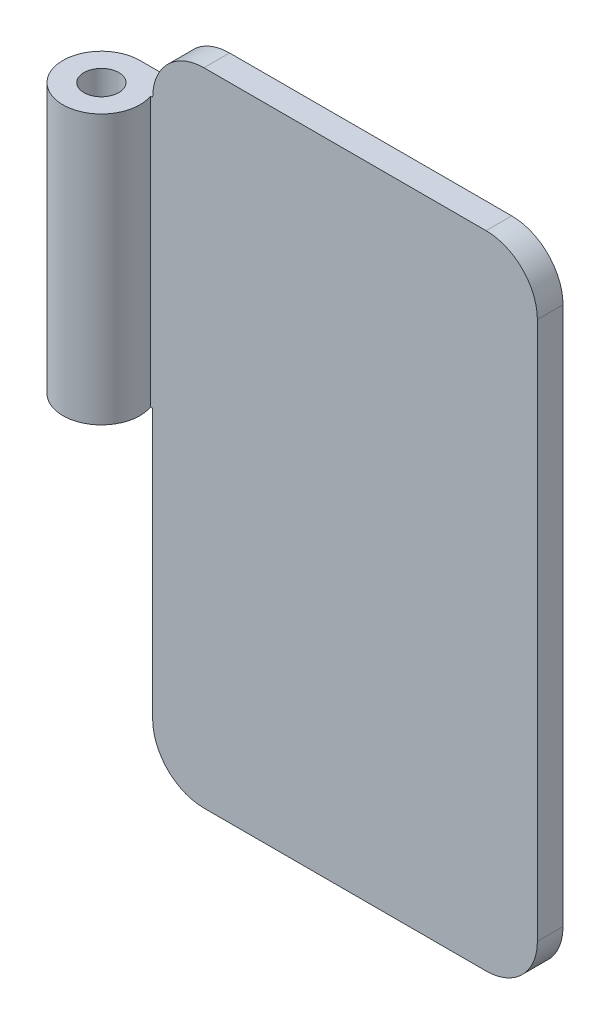
ISO-10303-21;
HEADER;
FILE_DESCRIPTION(('STEP AP214'),'2;1');
FILE_NAME('part.step','',(''),(''),'','','');
FILE_SCHEMA(('AUTOMOTIVE_DESIGN { 1 0 10303 214 1 1 1 1 }'));
ENDSEC;
DATA;
#1=APPLICATION_CONTEXT('core data for automotive mechanical design processes');
#2=APPLICATION_PROTOCOL_DEFINITION('international standard','automotive_design',2000,#1);
#3=PRODUCT_CONTEXT('',#1,'mechanical');
#4=PRODUCT('Part','Part','',(#3));
#5=PRODUCT_RELATED_PRODUCT_CATEGORY('part','',(#4));
#6=PRODUCT_DEFINITION_FORMATION('','',#4);
#7=PRODUCT_DEFINITION_CONTEXT('part definition',#1,'design');
#8=PRODUCT_DEFINITION('design','',#6,#7);
#9=PRODUCT_DEFINITION_SHAPE('','',#8);
#10=(LENGTH_UNIT() NAMED_UNIT(*) SI_UNIT(.MILLI.,.METRE.));
#11=(NAMED_UNIT(*) PLANE_ANGLE_UNIT() SI_UNIT($,.RADIAN.));
#12=(NAMED_UNIT(*) SI_UNIT($,.STERADIAN.) SOLID_ANGLE_UNIT());
#13=UNCERTAINTY_MEASURE_WITH_UNIT(LENGTH_MEASURE(1.E-05),#10,'distance_accuracy_value','');
#14=(GEOMETRIC_REPRESENTATION_CONTEXT(3) GLOBAL_UNCERTAINTY_ASSIGNED_CONTEXT((#13)) GLOBAL_UNIT_ASSIGNED_CONTEXT((#10,
#11,#12)) REPRESENTATION_CONTEXT('',''));
#15=CARTESIAN_POINT('',(0.,0.,0.));
#16=DIRECTION('',(0.,0.,1.));
#17=DIRECTION('',(1.,0.,0.));
#18=AXIS2_PLACEMENT_3D('',#15,#16,#17);
#19=CARTESIAN_POINT('',(6.75,14.125,1.));
#20=DIRECTION('',(0.,0.,-1.));
#21=DIRECTION('',(-1.,0.,0.));
#22=AXIS2_PLACEMENT_3D('',#19,#20,#21);
#23=CYLINDRICAL_SURFACE('',#22,2.);
#24=CARTESIAN_POINT('',(6.75,14.125,0.));
#25=DIRECTION('',(0.,0.,1.));
#26=DIRECTION('',(1.,0.,0.));
#27=AXIS2_PLACEMENT_3D('',#24,#25,#26);
#28=CIRCLE('',#27,2.);
#29=CARTESIAN_POINT('',(6.75000000000001,16.125,0.));
#30=VERTEX_POINT('',#29);
#31=CARTESIAN_POINT('',(4.75,14.125,0.));
#32=VERTEX_POINT('',#31);
#33=EDGE_CURVE('E156',#30,#32,#28,.T.);
#34=ORIENTED_EDGE('',*,*,#33,.T.);
#35=DIRECTION('',(0.,0.,-1.));
#36=VECTOR('',#35,1.);
#37=CARTESIAN_POINT('',(4.75,14.125,1.));
#38=LINE('',#37,#36);
#39=CARTESIAN_POINT('',(4.75,14.125,1.));
#40=VERTEX_POINT('',#39);
#41=EDGE_CURVE('E11',#40,#32,#38,.T.);
#42=ORIENTED_EDGE('',*,*,#41,.F.);
#43=CARTESIAN_POINT('',(6.75,14.125,1.));
#44=DIRECTION('',(0.,0.,1.));
#45=DIRECTION('',(1.,0.,0.));
#46=AXIS2_PLACEMENT_3D('',#43,#44,#45);
#47=CIRCLE('',#46,2.);
#48=CARTESIAN_POINT('',(6.75000000000001,16.125,1.));
#49=VERTEX_POINT('',#48);
#50=EDGE_CURVE('E107',#49,#40,#47,.T.);
#51=ORIENTED_EDGE('',*,*,#50,.F.);
#52=DIRECTION('',(0.,0.,-1.));
#53=VECTOR('',#52,1.);
#54=CARTESIAN_POINT('',(6.75000000000001,16.125,1.));
#55=LINE('',#54,#53);
#56=EDGE_CURVE('E152',#49,#30,#55,.T.);
#57=ORIENTED_EDGE('',*,*,#56,.T.);
#58=EDGE_LOOP('',(#34,#42,#51,#57));
#59=FACE_BOUND('',#58,.T.);
#60=ADVANCED_FACE('F44',(#59),#23,.T.);
#61=CARTESIAN_POINT('',(4.75,-6.875,1.));
#62=DIRECTION('',(1.,0.,0.));
#63=DIRECTION('',(0.,0.,-1.));
#64=AXIS2_PLACEMENT_3D('',#61,#62,#63);
#65=PLANE('',#64);
#66=DIRECTION('',(0.,-1.,0.));
#67=VECTOR('',#66,1.);
#68=CARTESIAN_POINT('',(4.75,-6.875,1.));
#69=LINE('',#68,#67);
#70=CARTESIAN_POINT('',(4.75,3.62499999999999,1.));
#71=VERTEX_POINT('',#70);
#72=CARTESIAN_POINT('',(4.75,-6.875,1.));
#73=VERTEX_POINT('',#72);
#74=EDGE_CURVE('E59',#71,#73,#69,.T.);
#75=ORIENTED_EDGE('',*,*,#74,.F.);
#76=DIRECTION('',(0.,0.,-1.));
#77=VECTOR('',#76,1.);
#78=CARTESIAN_POINT('',(4.75,3.62499999999999,0.));
#79=LINE('',#78,#77);
#80=CARTESIAN_POINT('',(4.75,3.62499999999999,0.));
#81=VERTEX_POINT('',#80);
#82=EDGE_CURVE('E236',#71,#81,#79,.T.);
#83=ORIENTED_EDGE('',*,*,#82,.T.);
#84=DIRECTION('',(0.,-1.,0.));
#85=VECTOR('',#84,1.);
#86=CARTESIAN_POINT('',(4.75,-6.875,0.));
#87=LINE('',#86,#85);
#88=CARTESIAN_POINT('',(4.75,-6.875,0.));
#89=VERTEX_POINT('',#88);
#90=EDGE_CURVE('E159',#81,#89,#87,.T.);
#91=ORIENTED_EDGE('',*,*,#90,.T.);
#92=DIRECTION('',(0.,0.,-1.));
#93=VECTOR('',#92,1.);
#94=CARTESIAN_POINT('',(4.75,-6.875,1.));
#95=LINE('',#94,#93);
#96=EDGE_CURVE('E52',#73,#89,#95,.T.);
#97=ORIENTED_EDGE('',*,*,#96,.F.);
#98=EDGE_LOOP('',(#75,#83,#91,#97));
#99=FACE_BOUND('',#98,.T.);
#100=ADVANCED_FACE('F289',(#99),#65,.F.);
#101=CARTESIAN_POINT('',(6.75,-6.87500000000001,1.));
#102=DIRECTION('',(0.,0.,-1.));
#103=DIRECTION('',(-1.,0.,0.));
#104=AXIS2_PLACEMENT_3D('',#101,#102,#103);
#105=CYLINDRICAL_SURFACE('',#104,2.);
#106=CARTESIAN_POINT('',(6.75,-6.87500000000001,0.));
#107=DIRECTION('',(0.,0.,1.));
#108=DIRECTION('',(1.,0.,0.));
#109=AXIS2_PLACEMENT_3D('',#106,#107,#108);
#110=CIRCLE('',#109,2.);
#111=CARTESIAN_POINT('',(6.75000000000001,-8.87500000000001,0.));
#112=VERTEX_POINT('',#111);
#113=EDGE_CURVE('E163',#89,#112,#110,.T.);
#114=ORIENTED_EDGE('',*,*,#113,.T.);
#115=DIRECTION('',(0.,0.,-1.));
#116=VECTOR('',#115,1.);
#117=CARTESIAN_POINT('',(6.75000000000001,-8.87500000000001,1.));
#118=LINE('',#117,#116);
#119=CARTESIAN_POINT('',(6.75000000000001,-8.87500000000001,1.));
#120=VERTEX_POINT('',#119);
#121=EDGE_CURVE('E189',#120,#112,#118,.T.);
#122=ORIENTED_EDGE('',*,*,#121,.F.);
#123=CARTESIAN_POINT('',(6.75,-6.87500000000001,1.));
#124=DIRECTION('',(0.,0.,1.));
#125=DIRECTION('',(1.,0.,0.));
#126=AXIS2_PLACEMENT_3D('',#123,#124,#125);
#127=CIRCLE('',#126,2.);
#128=EDGE_CURVE('E199',#73,#120,#127,.T.);
#129=ORIENTED_EDGE('',*,*,#128,.F.);
#130=ORIENTED_EDGE('',*,*,#96,.T.);
#131=EDGE_LOOP('',(#114,#122,#129,#130));
#132=FACE_BOUND('',#131,.T.);
#133=ADVANCED_FACE('F197',(#132),#105,.T.);
#134=CARTESIAN_POINT('',(17.75,-8.87500000000001,1.));
#135=DIRECTION('',(0.,1.,0.));
#136=DIRECTION('',(-1.,0.,0.));
#137=AXIS2_PLACEMENT_3D('',#134,#135,#136);
#138=PLANE('',#137);
#139=DIRECTION('',(1.,0.,0.));
#140=VECTOR('',#139,1.);
#141=CARTESIAN_POINT('',(17.75,-8.87500000000001,0.));
#142=LINE('',#141,#140);
#143=CARTESIAN_POINT('',(17.75,-8.87500000000001,0.));
#144=VERTEX_POINT('',#143);
#145=EDGE_CURVE('E166',#112,#144,#142,.T.);
#146=ORIENTED_EDGE('',*,*,#145,.T.);
#147=DIRECTION('',(0.,0.,-1.));
#148=VECTOR('',#147,1.);
#149=CARTESIAN_POINT('',(17.75,-8.87500000000001,1.));
#150=LINE('',#149,#148);
#151=CARTESIAN_POINT('',(17.75,-8.87500000000001,1.));
#152=VERTEX_POINT('',#151);
#153=EDGE_CURVE('E185',#152,#144,#150,.T.);
#154=ORIENTED_EDGE('',*,*,#153,.F.);
#155=DIRECTION('',(1.,0.,0.));
#156=VECTOR('',#155,1.);
#157=CARTESIAN_POINT('',(17.75,-8.87500000000001,1.));
#158=LINE('',#157,#156);
#159=EDGE_CURVE('E215',#120,#152,#158,.T.);
#160=ORIENTED_EDGE('',*,*,#159,.F.);
#161=ORIENTED_EDGE('',*,*,#121,.T.);
#162=EDGE_LOOP('',(#146,#154,#160,#161));
#163=FACE_BOUND('',#162,.T.);
#164=ADVANCED_FACE('F210',(#163),#138,.F.);
#165=CARTESIAN_POINT('',(17.75,-6.87500000000001,1.));
#166=DIRECTION('',(0.,0.,-1.));
#167=DIRECTION('',(-1.,0.,0.));
#168=AXIS2_PLACEMENT_3D('',#165,#166,#167);
#169=CYLINDRICAL_SURFACE('',#168,2.);
#170=CARTESIAN_POINT('',(17.75,-6.87500000000001,0.));
#171=DIRECTION('',(0.,0.,1.));
#172=DIRECTION('',(1.,0.,0.));
#173=AXIS2_PLACEMENT_3D('',#170,#171,#172);
#174=CIRCLE('',#173,2.);
#175=CARTESIAN_POINT('',(19.75,-6.875,0.));
#176=VERTEX_POINT('',#175);
#177=EDGE_CURVE('E169',#144,#176,#174,.T.);
#178=ORIENTED_EDGE('',*,*,#177,.T.);
#179=DIRECTION('',(0.,0.,-1.));
#180=VECTOR('',#179,1.);
#181=CARTESIAN_POINT('',(19.75,-6.875,1.));
#182=LINE('',#181,#180);
#183=CARTESIAN_POINT('',(19.75,-6.875,1.));
#184=VERTEX_POINT('',#183);
#185=EDGE_CURVE('E145',#184,#176,#182,.T.);
#186=ORIENTED_EDGE('',*,*,#185,.F.);
#187=CARTESIAN_POINT('',(17.75,-6.87500000000001,1.));
#188=DIRECTION('',(0.,0.,1.));
#189=DIRECTION('',(1.,0.,0.));
#190=AXIS2_PLACEMENT_3D('',#187,#188,#189);
#191=CIRCLE('',#190,2.);
#192=EDGE_CURVE('E131',#152,#184,#191,.T.);
#193=ORIENTED_EDGE('',*,*,#192,.F.);
#194=ORIENTED_EDGE('',*,*,#153,.T.);
#195=EDGE_LOOP('',(#178,#186,#193,#194));
#196=FACE_BOUND('',#195,.T.);
#197=ADVANCED_FACE('F213',(#196),#169,.T.);
#198=CARTESIAN_POINT('',(19.75,-6.875,1.));
#199=DIRECTION('',(-1.,0.,0.));
#200=DIRECTION('',(0.,0.,1.));
#201=AXIS2_PLACEMENT_3D('',#198,#199,#200);
#202=PLANE('',#201);
#203=DIRECTION('',(0.,1.,0.));
#204=VECTOR('',#203,1.);
#205=CARTESIAN_POINT('',(19.75,-6.875,0.));
#206=LINE('',#205,#204);
#207=CARTESIAN_POINT('',(19.75,14.125,0.));
#208=VERTEX_POINT('',#207);
#209=EDGE_CURVE('E141',#176,#208,#206,.T.);
#210=ORIENTED_EDGE('',*,*,#209,.T.);
#211=DIRECTION('',(0.,0.,-1.));
#212=VECTOR('',#211,1.);
#213=CARTESIAN_POINT('',(19.75,14.125,1.));
#214=LINE('',#213,#212);
#215=CARTESIAN_POINT('',(19.75,14.125,1.));
#216=VERTEX_POINT('',#215);
#217=EDGE_CURVE('E138',#216,#208,#214,.T.);
#218=ORIENTED_EDGE('',*,*,#217,.F.);
#219=DIRECTION('',(0.,1.,0.));
#220=VECTOR('',#219,1.);
#221=CARTESIAN_POINT('',(19.75,-6.875,1.));
#222=LINE('',#221,#220);
#223=EDGE_CURVE('E124',#184,#216,#222,.T.);
#224=ORIENTED_EDGE('',*,*,#223,.F.);
#225=ORIENTED_EDGE('',*,*,#185,.T.);
#226=EDGE_LOOP('',(#210,#218,#224,#225));
#227=FACE_BOUND('',#226,.T.);
#228=ADVANCED_FACE('F139',(#227),#202,.F.);
#229=CARTESIAN_POINT('',(17.75,14.125,1.));
#230=DIRECTION('',(0.,0.,-1.));
#231=DIRECTION('',(-1.,0.,0.));
#232=AXIS2_PLACEMENT_3D('',#229,#230,#231);
#233=CYLINDRICAL_SURFACE('',#232,2.);
#234=CARTESIAN_POINT('',(17.75,14.125,0.));
#235=DIRECTION('',(0.,0.,1.));
#236=DIRECTION('',(1.,0.,0.));
#237=AXIS2_PLACEMENT_3D('',#234,#235,#236);
#238=CIRCLE('',#237,2.);
#239=CARTESIAN_POINT('',(17.75,16.125,0.));
#240=VERTEX_POINT('',#239);
#241=EDGE_CURVE('E174',#208,#240,#238,.T.);
#242=ORIENTED_EDGE('',*,*,#241,.T.);
#243=DIRECTION('',(0.,0.,-1.));
#244=VECTOR('',#243,1.);
#245=CARTESIAN_POINT('',(17.75,16.125,1.));
#246=LINE('',#245,#244);
#247=CARTESIAN_POINT('',(17.75,16.125,1.));
#248=VERTEX_POINT('',#247);
#249=EDGE_CURVE('E146',#248,#240,#246,.T.);
#250=ORIENTED_EDGE('',*,*,#249,.F.);
#251=CARTESIAN_POINT('',(17.75,14.125,1.));
#252=DIRECTION('',(0.,0.,1.));
#253=DIRECTION('',(1.,0.,0.));
#254=AXIS2_PLACEMENT_3D('',#251,#252,#253);
#255=CIRCLE('',#254,2.);
#256=EDGE_CURVE('E128',#216,#248,#255,.T.);
#257=ORIENTED_EDGE('',*,*,#256,.F.);
#258=ORIENTED_EDGE('',*,*,#217,.T.);
#259=EDGE_LOOP('',(#242,#250,#257,#258));
#260=FACE_BOUND('',#259,.T.);
#261=ADVANCED_FACE('F148',(#260),#233,.T.);
#262=CARTESIAN_POINT('',(17.75,16.125,1.));
#263=DIRECTION('',(0.,-1.,0.));
#264=DIRECTION('',(1.,0.,0.));
#265=AXIS2_PLACEMENT_3D('',#262,#263,#264);
#266=PLANE('',#265);
#267=DIRECTION('',(-1.,0.,0.));
#268=VECTOR('',#267,1.);
#269=CARTESIAN_POINT('',(17.75,16.125,0.));
#270=LINE('',#269,#268);
#271=EDGE_CURVE('E101',#240,#30,#270,.T.);
#272=ORIENTED_EDGE('',*,*,#271,.T.);
#273=ORIENTED_EDGE('',*,*,#56,.F.);
#274=DIRECTION('',(-1.,0.,0.));
#275=VECTOR('',#274,1.);
#276=CARTESIAN_POINT('',(17.75,16.125,1.));
#277=LINE('',#276,#275);
#278=EDGE_CURVE('E68',#248,#49,#277,.T.);
#279=ORIENTED_EDGE('',*,*,#278,.F.);
#280=ORIENTED_EDGE('',*,*,#249,.T.);
#281=EDGE_LOOP('',(#272,#273,#279,#280));
#282=FACE_BOUND('',#281,.T.);
#283=ADVANCED_FACE('F306',(#282),#266,.F.);
#284=CARTESIAN_POINT('',(6.75,14.125,1.));
#285=DIRECTION('',(0.,0.,1.));
#286=DIRECTION('',(1.,0.,0.));
#287=AXIS2_PLACEMENT_3D('',#284,#285,#286);
#288=PLANE('',#287);
#289=ORIENTED_EDGE('',*,*,#50,.T.);
#290=DIRECTION('',(-1.,0.,0.));
#291=VECTOR('',#290,1.);
#292=CARTESIAN_POINT('',(0.,14.125,1.));
#293=LINE('',#292,#291);
#294=CARTESIAN_POINT('',(4.66421356237309,14.125,1.));
#295=VERTEX_POINT('',#294);
#296=EDGE_CURVE('E160',#40,#295,#293,.T.);
#297=ORIENTED_EDGE('',*,*,#296,.T.);
#298=DIRECTION('',(0.,1.,0.));
#299=VECTOR('',#298,1.);
#300=CARTESIAN_POINT('',(4.66421356237309,1.82222436226799,1.));
#301=LINE('',#300,#299);
#302=CARTESIAN_POINT('',(4.66421356237309,3.62499999999999,1.));
#303=VERTEX_POINT('',#302);
#304=EDGE_CURVE('E229',#303,#295,#301,.T.);
#305=ORIENTED_EDGE('',*,*,#304,.F.);
#306=DIRECTION('',(-1.,0.,0.));
#307=VECTOR('',#306,1.);
#308=CARTESIAN_POINT('',(0.,3.62499999999999,1.));
#309=LINE('',#308,#307);
#310=EDGE_CURVE('E237',#71,#303,#309,.T.);
#311=ORIENTED_EDGE('',*,*,#310,.F.);
#312=ORIENTED_EDGE('',*,*,#74,.T.);
#313=ORIENTED_EDGE('',*,*,#128,.T.);
#314=ORIENTED_EDGE('',*,*,#159,.T.);
#315=ORIENTED_EDGE('',*,*,#192,.T.);
#316=ORIENTED_EDGE('',*,*,#223,.T.);
#317=ORIENTED_EDGE('',*,*,#256,.T.);
#318=ORIENTED_EDGE('',*,*,#278,.T.);
#319=EDGE_LOOP('',(#289,#297,#305,#311,#312,#313,#314,#315,#316,#317,#318));
#320=FACE_BOUND('',#319,.T.);
#321=ADVANCED_FACE('F126',(#320),#288,.T.);
#322=CARTESIAN_POINT('',(6.75,14.125,0.));
#323=DIRECTION('',(0.,0.,1.));
#324=DIRECTION('',(1.,0.,0.));
#325=AXIS2_PLACEMENT_3D('',#322,#323,#324);
#326=PLANE('',#325);
#327=ORIENTED_EDGE('',*,*,#33,.F.);
#328=ORIENTED_EDGE('',*,*,#271,.F.);
#329=ORIENTED_EDGE('',*,*,#241,.F.);
#330=ORIENTED_EDGE('',*,*,#209,.F.);
#331=ORIENTED_EDGE('',*,*,#177,.F.);
#332=ORIENTED_EDGE('',*,*,#145,.F.);
#333=ORIENTED_EDGE('',*,*,#113,.F.);
#334=ORIENTED_EDGE('',*,*,#90,.F.);
#335=DIRECTION('',(-1.,0.,0.));
#336=VECTOR('',#335,1.);
#337=CARTESIAN_POINT('',(0.,3.62499999999999,0.));
#338=LINE('',#337,#336);
#339=CARTESIAN_POINT('',(3.25,3.62499999999999,0.));
#340=VERTEX_POINT('',#339);
#341=EDGE_CURVE('E230',#81,#340,#338,.T.);
#342=ORIENTED_EDGE('',*,*,#341,.T.);
#343=DIRECTION('',(0.,1.,0.));
#344=VECTOR('',#343,1.);
#345=CARTESIAN_POINT('',(3.25,1.82222436226799,0.));
#346=LINE('',#345,#344);
#347=CARTESIAN_POINT('',(3.25,14.125,0.));
#348=VERTEX_POINT('',#347);
#349=EDGE_CURVE('E225',#340,#348,#346,.T.);
#350=ORIENTED_EDGE('',*,*,#349,.T.);
#351=DIRECTION('',(-1.,0.,0.));
#352=VECTOR('',#351,1.);
#353=CARTESIAN_POINT('',(0.,14.125,0.));
#354=LINE('',#353,#352);
#355=EDGE_CURVE('E241',#32,#348,#354,.T.);
#356=ORIENTED_EDGE('',*,*,#355,.F.);
#357=EDGE_LOOP('',(#327,#328,#329,#330,#331,#332,#333,#334,#342,#350,#356));
#358=FACE_BOUND('',#357,.T.);
#359=ADVANCED_FACE('F204',(#358),#326,.F.);
#360=CARTESIAN_POINT('',(0.,3.62499999999999,1.5));
#361=DIRECTION('',(0.,-1.,0.));
#362=DIRECTION('',(1.,0.,0.));
#363=AXIS2_PLACEMENT_3D('',#360,#361,#362);
#364=PLANE('',#363);
#365=ORIENTED_EDGE('',*,*,#82,.F.);
#366=ORIENTED_EDGE('',*,*,#310,.T.);
#367=CARTESIAN_POINT('',(3.25,3.62499999999999,1.5));
#368=DIRECTION('',(0.,1.,0.));
#369=DIRECTION('',(-1.,0.,0.));
#370=AXIS2_PLACEMENT_3D('',#367,#368,#369);
#371=CIRCLE('',#370,1.5);
#372=EDGE_CURVE('E242',#340,#303,#371,.T.);
#373=ORIENTED_EDGE('',*,*,#372,.F.);
#374=ORIENTED_EDGE('',*,*,#341,.F.);
#375=EDGE_LOOP('',(#365,#366,#373,#374));
#376=FACE_BOUND('',#375,.T.);
#377=CARTESIAN_POINT('',(3.25,3.62499999999999,1.5));
#378=DIRECTION('',(0.,1.,0.));
#379=DIRECTION('',(-1.,0.,0.));
#380=AXIS2_PLACEMENT_3D('',#377,#378,#379);
#381=CIRCLE('',#380,0.680000000000002);
#382=CARTESIAN_POINT('',(2.56999999999999,3.62499999999999,1.5));
#383=VERTEX_POINT('',#382);
#384=EDGE_CURVE('E261',#383,#383,#381,.T.);
#385=ORIENTED_EDGE('',*,*,#384,.T.);
#386=EDGE_LOOP('',(#385));
#387=FACE_BOUND('',#386,.T.);
#388=ADVANCED_FACE('F266',(#376,#387),#364,.T.);
#389=CARTESIAN_POINT('',(0.,14.125,0.));
#390=DIRECTION('',(0.,1.,0.));
#391=DIRECTION('',(0.,0.,1.));
#392=AXIS2_PLACEMENT_3D('',#389,#390,#391);
#393=PLANE('',#392);
#394=ORIENTED_EDGE('',*,*,#296,.F.);
#395=ORIENTED_EDGE('',*,*,#41,.T.);
#396=ORIENTED_EDGE('',*,*,#355,.T.);
#397=CARTESIAN_POINT('',(3.25,14.125,1.5));
#398=DIRECTION('',(0.,1.,0.));
#399=DIRECTION('',(-1.,0.,0.));
#400=AXIS2_PLACEMENT_3D('',#397,#398,#399);
#401=CIRCLE('',#400,1.5);
#402=EDGE_CURVE('E253',#348,#295,#401,.T.);
#403=ORIENTED_EDGE('',*,*,#402,.T.);
#404=EDGE_LOOP('',(#394,#395,#396,#403));
#405=FACE_BOUND('',#404,.T.);
#406=CARTESIAN_POINT('',(3.25,14.125,1.5));
#407=DIRECTION('',(0.,1.,0.));
#408=DIRECTION('',(-1.,0.,0.));
#409=AXIS2_PLACEMENT_3D('',#406,#407,#408);
#410=CIRCLE('',#409,0.680000000000002);
#411=CARTESIAN_POINT('',(2.56999999999999,14.125,1.5));
#412=VERTEX_POINT('',#411);
#413=EDGE_CURVE('E257',#412,#412,#410,.T.);
#414=ORIENTED_EDGE('',*,*,#413,.F.);
#415=EDGE_LOOP('',(#414));
#416=FACE_BOUND('',#415,.T.);
#417=ADVANCED_FACE('F275',(#405,#416),#393,.T.);
#418=CARTESIAN_POINT('',(3.25,14.125,1.5));
#419=DIRECTION('',(0.,1.,0.));
#420=DIRECTION('',(-1.,0.,0.));
#421=AXIS2_PLACEMENT_3D('',#418,#419,#420);
#422=CYLINDRICAL_SURFACE('',#421,1.5);
#423=ORIENTED_EDGE('',*,*,#372,.T.);
#424=ORIENTED_EDGE('',*,*,#304,.T.);
#425=ORIENTED_EDGE('',*,*,#402,.F.);
#426=ORIENTED_EDGE('',*,*,#349,.F.);
#427=EDGE_LOOP('',(#423,#424,#425,#426));
#428=FACE_BOUND('',#427,.T.);
#429=ADVANCED_FACE('F271',(#428),#422,.T.);
#430=CARTESIAN_POINT('',(3.25,14.125,1.5));
#431=DIRECTION('',(0.,1.,0.));
#432=DIRECTION('',(-1.,0.,0.));
#433=AXIS2_PLACEMENT_3D('',#430,#431,#432);
#434=CYLINDRICAL_SURFACE('',#433,0.680000000000002);
#435=ORIENTED_EDGE('',*,*,#384,.F.);
#436=EDGE_LOOP('',(#435));
#437=FACE_BOUND('',#436,.T.);
#438=ORIENTED_EDGE('',*,*,#413,.T.);
#439=EDGE_LOOP('',(#438));
#440=FACE_BOUND('',#439,.T.);
#441=ADVANCED_FACE('F268',(#437,#440),#434,.F.);
#442=CLOSED_SHELL('',(#60,#100,#133,#164,#197,#228,#261,#283,#321,#359,#388,#417,#429,#441));
#443=MANIFOLD_SOLID_BREP('B2',#442);
#444=ADVANCED_BREP_SHAPE_REPRESENTATION('',(#18,#443),#14);
#445=SHAPE_DEFINITION_REPRESENTATION(#9,#444);
ENDSEC;
END-ISO-10303-21;
